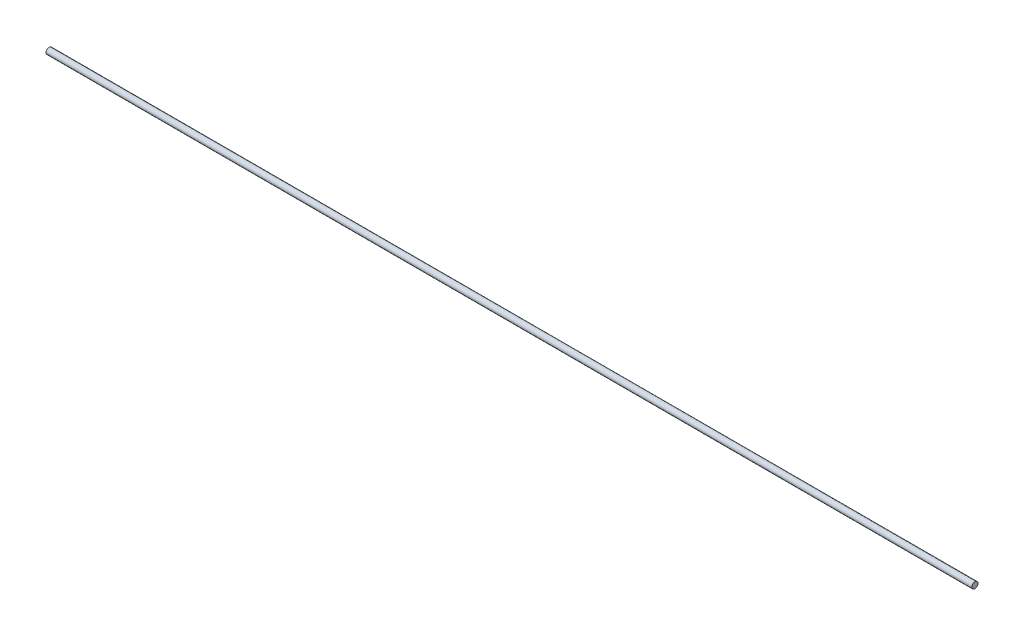
ISO-10303-21;
HEADER;
FILE_DESCRIPTION(('STEP AP214'),'2;1');
FILE_NAME('part.step','',(''),(''),'','','');
FILE_SCHEMA(('AUTOMOTIVE_DESIGN { 1 0 10303 214 1 1 1 1 }'));
ENDSEC;
DATA;
#1=APPLICATION_CONTEXT('core data for automotive mechanical design processes');
#2=APPLICATION_PROTOCOL_DEFINITION('international standard','automotive_design',2000,#1);
#3=PRODUCT_CONTEXT('',#1,'mechanical');
#4=PRODUCT('Part','Part','',(#3));
#5=PRODUCT_RELATED_PRODUCT_CATEGORY('part','',(#4));
#6=PRODUCT_DEFINITION_FORMATION('','',#4);
#7=PRODUCT_DEFINITION_CONTEXT('part definition',#1,'design');
#8=PRODUCT_DEFINITION('design','',#6,#7);
#9=PRODUCT_DEFINITION_SHAPE('','',#8);
#10=(LENGTH_UNIT() NAMED_UNIT(*) SI_UNIT(.MILLI.,.METRE.));
#11=(NAMED_UNIT(*) PLANE_ANGLE_UNIT() SI_UNIT($,.RADIAN.));
#12=(NAMED_UNIT(*) SI_UNIT($,.STERADIAN.) SOLID_ANGLE_UNIT());
#13=UNCERTAINTY_MEASURE_WITH_UNIT(LENGTH_MEASURE(1.E-05),#10,'distance_accuracy_value','');
#14=(GEOMETRIC_REPRESENTATION_CONTEXT(3) GLOBAL_UNCERTAINTY_ASSIGNED_CONTEXT((#13)) GLOBAL_UNIT_ASSIGNED_CONTEXT((#10,
#11,#12)) REPRESENTATION_CONTEXT('',''));
#15=CARTESIAN_POINT('',(0.,0.,0.));
#16=DIRECTION('',(0.,0.,1.));
#17=DIRECTION('',(1.,0.,0.));
#18=AXIS2_PLACEMENT_3D('',#15,#16,#17);
#19=CARTESIAN_POINT('',(150.,0.,0.));
#20=DIRECTION('',(-1.,0.,0.));
#21=DIRECTION('',(0.,0.,1.));
#22=AXIS2_PLACEMENT_3D('',#19,#20,#21);
#23=CYLINDRICAL_SURFACE('',#22,0.5);
#24=CARTESIAN_POINT('',(150.,0.,0.));
#25=DIRECTION('',(1.,0.,0.));
#26=DIRECTION('',(0.,0.,-1.));
#27=AXIS2_PLACEMENT_3D('',#24,#25,#26);
#28=CIRCLE('',#27,0.5);
#29=CARTESIAN_POINT('',(150.,0.,-0.5));
#30=VERTEX_POINT('',#29);
#31=EDGE_CURVE('E10',#30,#30,#28,.T.);
#32=ORIENTED_EDGE('',*,*,#31,.F.);
#33=EDGE_LOOP('',(#32));
#34=FACE_BOUND('',#33,.T.);
#35=CARTESIAN_POINT('',(0.,0.,0.));
#36=DIRECTION('',(1.,0.,0.));
#37=DIRECTION('',(0.,0.,-1.));
#38=AXIS2_PLACEMENT_3D('',#35,#36,#37);
#39=CIRCLE('',#38,0.5);
#40=CARTESIAN_POINT('',(0.,0.,-0.5));
#41=VERTEX_POINT('',#40);
#42=EDGE_CURVE('E37',#41,#41,#39,.T.);
#43=ORIENTED_EDGE('',*,*,#42,.T.);
#44=EDGE_LOOP('',(#43));
#45=FACE_BOUND('',#44,.T.);
#46=ADVANCED_FACE('F34',(#34,#45),#23,.T.);
#47=CARTESIAN_POINT('',(150.,0.,0.));
#48=DIRECTION('',(1.,0.,0.));
#49=DIRECTION('',(0.,0.,-1.));
#50=AXIS2_PLACEMENT_3D('',#47,#48,#49);
#51=PLANE('',#50);
#52=ORIENTED_EDGE('',*,*,#31,.T.);
#53=EDGE_LOOP('',(#52));
#54=FACE_BOUND('',#53,.T.);
#55=ADVANCED_FACE('F49',(#54),#51,.T.);
#56=CARTESIAN_POINT('',(0.,0.,0.));
#57=DIRECTION('',(1.,0.,0.));
#58=DIRECTION('',(0.,0.,-1.));
#59=AXIS2_PLACEMENT_3D('',#56,#57,#58);
#60=PLANE('',#59);
#61=ORIENTED_EDGE('',*,*,#42,.F.);
#62=EDGE_LOOP('',(#61));
#63=FACE_BOUND('',#62,.T.);
#64=ADVANCED_FACE('F47',(#63),#60,.F.);
#65=CLOSED_SHELL('',(#46,#55,#64));
#66=MANIFOLD_SOLID_BREP('B2',#65);
#67=ADVANCED_BREP_SHAPE_REPRESENTATION('',(#18,#66),#14);
#68=SHAPE_DEFINITION_REPRESENTATION(#9,#67);
ENDSEC;
END-ISO-10303-21;
